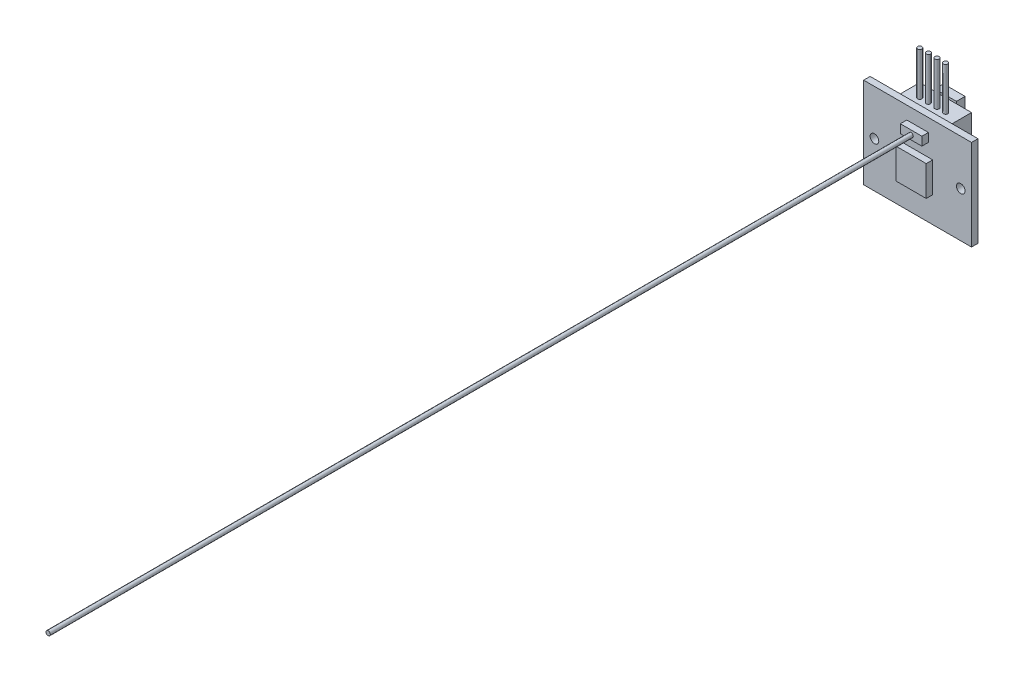
ISO-10303-21;
HEADER;
FILE_DESCRIPTION(('STEP AP214'),'2;1');
FILE_NAME('part.step','',(''),(''),'','','');
FILE_SCHEMA(('AUTOMOTIVE_DESIGN { 1 0 10303 214 1 1 1 1 }'));
ENDSEC;
DATA;
#1=APPLICATION_CONTEXT('core data for automotive mechanical design processes');
#2=APPLICATION_PROTOCOL_DEFINITION('international standard','automotive_design',2000,#1);
#3=PRODUCT_CONTEXT('',#1,'mechanical');
#4=PRODUCT('Part','Part','',(#3));
#5=PRODUCT_RELATED_PRODUCT_CATEGORY('part','',(#4));
#6=PRODUCT_DEFINITION_FORMATION('','',#4);
#7=PRODUCT_DEFINITION_CONTEXT('part definition',#1,'design');
#8=PRODUCT_DEFINITION('design','',#6,#7);
#9=PRODUCT_DEFINITION_SHAPE('','',#8);
#10=(LENGTH_UNIT() NAMED_UNIT(*) SI_UNIT(.MILLI.,.METRE.));
#11=(NAMED_UNIT(*) PLANE_ANGLE_UNIT() SI_UNIT($,.RADIAN.));
#12=(NAMED_UNIT(*) SI_UNIT($,.STERADIAN.) SOLID_ANGLE_UNIT());
#13=UNCERTAINTY_MEASURE_WITH_UNIT(LENGTH_MEASURE(1.E-05),#10,'distance_accuracy_value','');
#14=(GEOMETRIC_REPRESENTATION_CONTEXT(3) GLOBAL_UNCERTAINTY_ASSIGNED_CONTEXT((#13)) GLOBAL_UNIT_ASSIGNED_CONTEXT((#10,
#11,#12)) REPRESENTATION_CONTEXT('',''));
#15=CARTESIAN_POINT('',(0.,0.,0.));
#16=DIRECTION('',(0.,0.,1.));
#17=DIRECTION('',(1.,0.,0.));
#18=AXIS2_PLACEMENT_3D('',#15,#16,#17);
#19=CARTESIAN_POINT('',(0.,6.5,203.));
#20=DIRECTION('',(0.,0.,-1.));
#21=DIRECTION('',(-1.,0.,0.));
#22=AXIS2_PLACEMENT_3D('',#19,#20,#21);
#23=CYLINDRICAL_SURFACE('',#22,0.5);
#24=CARTESIAN_POINT('',(0.,6.5,203.));
#25=DIRECTION('',(0.,0.,1.));
#26=DIRECTION('',(1.,0.,0.));
#27=AXIS2_PLACEMENT_3D('',#24,#25,#26);
#28=CIRCLE('',#27,0.5);
#29=CARTESIAN_POINT('',(0.5,6.5,203.));
#30=VERTEX_POINT('',#29);
#31=EDGE_CURVE('E11',#30,#30,#28,.T.);
#32=ORIENTED_EDGE('',*,*,#31,.F.);
#33=EDGE_LOOP('',(#32));
#34=FACE_BOUND('',#33,.T.);
#35=CARTESIAN_POINT('',(0.,6.5,3.));
#36=DIRECTION('',(0.,0.,1.));
#37=DIRECTION('',(1.,0.,0.));
#38=AXIS2_PLACEMENT_3D('',#35,#36,#37);
#39=CIRCLE('',#38,0.5);
#40=CARTESIAN_POINT('',(0.5,6.5,3.));
#41=VERTEX_POINT('',#40);
#42=EDGE_CURVE('E46',#41,#41,#39,.T.);
#43=ORIENTED_EDGE('',*,*,#42,.T.);
#44=EDGE_LOOP('',(#43));
#45=FACE_BOUND('',#44,.T.);
#46=ADVANCED_FACE('F43',(#34,#45),#23,.T.);
#47=CARTESIAN_POINT('',(0.,6.5,203.));
#48=DIRECTION('',(0.,0.,1.));
#49=DIRECTION('',(1.,0.,0.));
#50=AXIS2_PLACEMENT_3D('',#47,#48,#49);
#51=PLANE('',#50);
#52=ORIENTED_EDGE('',*,*,#31,.T.);
#53=EDGE_LOOP('',(#52));
#54=FACE_BOUND('',#53,.T.);
#55=ADVANCED_FACE('F58',(#54),#51,.T.);
#56=CARTESIAN_POINT('',(0.,6.5,3.));
#57=DIRECTION('',(0.,0.,1.));
#58=DIRECTION('',(1.,0.,0.));
#59=AXIS2_PLACEMENT_3D('',#56,#57,#58);
#60=PLANE('',#59);
#61=ORIENTED_EDGE('',*,*,#42,.F.);
#62=EDGE_LOOP('',(#61));
#63=FACE_BOUND('',#62,.T.);
#64=ADVANCED_FACE('F56',(#63),#60,.F.);
#65=CLOSED_SHELL('',(#46,#55,#64));
#66=MANIFOLD_SOLID_BREP('B2_NOT_SHOWN',#65);
#67=CARTESIAN_POINT('',(3.,20.,-2.));
#68=DIRECTION('',(0.,-1.,0.));
#69=DIRECTION('',(1.,0.,0.));
#70=AXIS2_PLACEMENT_3D('',#67,#68,#69);
#71=CYLINDRICAL_SURFACE('',#70,0.5);
#72=CARTESIAN_POINT('',(3.,20.,-2.));
#73=DIRECTION('',(0.,1.,0.));
#74=DIRECTION('',(-1.,0.,0.));
#75=AXIS2_PLACEMENT_3D('',#72,#73,#74);
#76=CIRCLE('',#75,0.5);
#77=CARTESIAN_POINT('',(2.5,20.,-2.));
#78=VERTEX_POINT('',#77);
#79=EDGE_CURVE('E42',#78,#78,#76,.T.);
#80=ORIENTED_EDGE('',*,*,#79,.F.);
#81=EDGE_LOOP('',(#80));
#82=FACE_BOUND('',#81,.T.);
#83=CARTESIAN_POINT('',(3.,10.,-2.));
#84=DIRECTION('',(0.,1.,0.));
#85=DIRECTION('',(-1.,0.,0.));
#86=AXIS2_PLACEMENT_3D('',#83,#84,#85);
#87=CIRCLE('',#86,0.5);
#88=CARTESIAN_POINT('',(2.5,10.,-2.));
#89=VERTEX_POINT('',#88);
#90=EDGE_CURVE('E94',#89,#89,#87,.T.);
#91=ORIENTED_EDGE('',*,*,#90,.T.);
#92=EDGE_LOOP('',(#91));
#93=FACE_BOUND('',#92,.T.);
#94=ADVANCED_FACE('F91',(#82,#93),#71,.T.);
#95=CARTESIAN_POINT('',(3.,20.,-2.));
#96=DIRECTION('',(0.,1.,0.));
#97=DIRECTION('',(-1.,0.,0.));
#98=AXIS2_PLACEMENT_3D('',#95,#96,#97);
#99=PLANE('',#98);
#100=ORIENTED_EDGE('',*,*,#79,.T.);
#101=EDGE_LOOP('',(#100));
#102=FACE_BOUND('',#101,.T.);
#103=ADVANCED_FACE('F106',(#102),#99,.T.);
#104=CARTESIAN_POINT('',(3.,10.,-2.));
#105=DIRECTION('',(0.,1.,0.));
#106=DIRECTION('',(-1.,0.,0.));
#107=AXIS2_PLACEMENT_3D('',#104,#105,#106);
#108=PLANE('',#107);
#109=ORIENTED_EDGE('',*,*,#90,.F.);
#110=EDGE_LOOP('',(#109));
#111=FACE_BOUND('',#110,.T.);
#112=ADVANCED_FACE('F104',(#111),#108,.F.);
#113=CLOSED_SHELL('',(#94,#103,#112));
#114=MANIFOLD_SOLID_BREP('B6',#113);
#115=CARTESIAN_POINT('',(1.,20.,-2.));
#116=DIRECTION('',(0.,-1.,0.));
#117=DIRECTION('',(1.,0.,0.));
#118=AXIS2_PLACEMENT_3D('',#115,#116,#117);
#119=CYLINDRICAL_SURFACE('',#118,0.5);
#120=CARTESIAN_POINT('',(1.,20.,-2.));
#121=DIRECTION('',(0.,1.,0.));
#122=DIRECTION('',(-1.,0.,0.));
#123=AXIS2_PLACEMENT_3D('',#120,#121,#122);
#124=CIRCLE('',#123,0.5);
#125=CARTESIAN_POINT('',(0.500000000000003,20.,-2.));
#126=VERTEX_POINT('',#125);
#127=EDGE_CURVE('E90',#126,#126,#124,.T.);
#128=ORIENTED_EDGE('',*,*,#127,.F.);
#129=EDGE_LOOP('',(#128));
#130=FACE_BOUND('',#129,.T.);
#131=CARTESIAN_POINT('',(1.,10.,-2.));
#132=DIRECTION('',(0.,1.,0.));
#133=DIRECTION('',(-1.,0.,0.));
#134=AXIS2_PLACEMENT_3D('',#131,#132,#133);
#135=CIRCLE('',#134,0.5);
#136=CARTESIAN_POINT('',(0.500000000000001,10.,-2.));
#137=VERTEX_POINT('',#136);
#138=EDGE_CURVE('E142',#137,#137,#135,.T.);
#139=ORIENTED_EDGE('',*,*,#138,.T.);
#140=EDGE_LOOP('',(#139));
#141=FACE_BOUND('',#140,.T.);
#142=ADVANCED_FACE('F139',(#130,#141),#119,.T.);
#143=CARTESIAN_POINT('',(1.,20.,-2.));
#144=DIRECTION('',(0.,1.,0.));
#145=DIRECTION('',(-1.,0.,0.));
#146=AXIS2_PLACEMENT_3D('',#143,#144,#145);
#147=PLANE('',#146);
#148=ORIENTED_EDGE('',*,*,#127,.T.);
#149=EDGE_LOOP('',(#148));
#150=FACE_BOUND('',#149,.T.);
#151=ADVANCED_FACE('F154',(#150),#147,.T.);
#152=CARTESIAN_POINT('',(1.,10.,-2.));
#153=DIRECTION('',(0.,1.,0.));
#154=DIRECTION('',(-1.,0.,0.));
#155=AXIS2_PLACEMENT_3D('',#152,#153,#154);
#156=PLANE('',#155);
#157=ORIENTED_EDGE('',*,*,#138,.F.);
#158=EDGE_LOOP('',(#157));
#159=FACE_BOUND('',#158,.T.);
#160=ADVANCED_FACE('F152',(#159),#156,.F.);
#161=CLOSED_SHELL('',(#142,#151,#160));
#162=MANIFOLD_SOLID_BREP('B37',#161);
#163=CARTESIAN_POINT('',(-0.999999999999997,20.,-2.));
#164=DIRECTION('',(0.,-1.,0.));
#165=DIRECTION('',(1.,0.,0.));
#166=AXIS2_PLACEMENT_3D('',#163,#164,#165);
#167=CYLINDRICAL_SURFACE('',#166,0.5);
#168=CARTESIAN_POINT('',(-0.999999999999997,20.,-2.));
#169=DIRECTION('',(0.,1.,0.));
#170=DIRECTION('',(-1.,0.,0.));
#171=AXIS2_PLACEMENT_3D('',#168,#169,#170);
#172=CIRCLE('',#171,0.5);
#173=CARTESIAN_POINT('',(-1.5,20.,-2.));
#174=VERTEX_POINT('',#173);
#175=EDGE_CURVE('E138',#174,#174,#172,.T.);
#176=ORIENTED_EDGE('',*,*,#175,.F.);
#177=EDGE_LOOP('',(#176));
#178=FACE_BOUND('',#177,.T.);
#179=CARTESIAN_POINT('',(-0.999999999999999,10.,-2.));
#180=DIRECTION('',(0.,1.,0.));
#181=DIRECTION('',(-1.,0.,0.));
#182=AXIS2_PLACEMENT_3D('',#179,#180,#181);
#183=CIRCLE('',#182,0.5);
#184=CARTESIAN_POINT('',(-1.5,10.,-2.));
#185=VERTEX_POINT('',#184);
#186=EDGE_CURVE('E190',#185,#185,#183,.T.);
#187=ORIENTED_EDGE('',*,*,#186,.T.);
#188=EDGE_LOOP('',(#187));
#189=FACE_BOUND('',#188,.T.);
#190=ADVANCED_FACE('F187',(#178,#189),#167,.T.);
#191=CARTESIAN_POINT('',(-0.999999999999997,20.,-2.));
#192=DIRECTION('',(0.,1.,0.));
#193=DIRECTION('',(-1.,0.,0.));
#194=AXIS2_PLACEMENT_3D('',#191,#192,#193);
#195=PLANE('',#194);
#196=ORIENTED_EDGE('',*,*,#175,.T.);
#197=EDGE_LOOP('',(#196));
#198=FACE_BOUND('',#197,.T.);
#199=ADVANCED_FACE('F202',(#198),#195,.T.);
#200=CARTESIAN_POINT('',(-0.999999999999999,10.,-2.));
#201=DIRECTION('',(0.,1.,0.));
#202=DIRECTION('',(-1.,0.,0.));
#203=AXIS2_PLACEMENT_3D('',#200,#201,#202);
#204=PLANE('',#203);
#205=ORIENTED_EDGE('',*,*,#186,.F.);
#206=EDGE_LOOP('',(#205));
#207=FACE_BOUND('',#206,.T.);
#208=ADVANCED_FACE('F200',(#207),#204,.F.);
#209=CLOSED_SHELL('',(#190,#199,#208));
#210=MANIFOLD_SOLID_BREP('B85',#209);
#211=CARTESIAN_POINT('',(-3.,20.,-2.));
#212=DIRECTION('',(0.,-1.,0.));
#213=DIRECTION('',(1.,0.,0.));
#214=AXIS2_PLACEMENT_3D('',#211,#212,#213);
#215=CYLINDRICAL_SURFACE('',#214,0.5);
#216=CARTESIAN_POINT('',(-3.,20.,-2.));
#217=DIRECTION('',(0.,1.,0.));
#218=DIRECTION('',(-1.,0.,0.));
#219=AXIS2_PLACEMENT_3D('',#216,#217,#218);
#220=CIRCLE('',#219,0.5);
#221=CARTESIAN_POINT('',(-3.5,20.,-2.));
#222=VERTEX_POINT('',#221);
#223=EDGE_CURVE('E186',#222,#222,#220,.T.);
#224=ORIENTED_EDGE('',*,*,#223,.F.);
#225=EDGE_LOOP('',(#224));
#226=FACE_BOUND('',#225,.T.);
#227=CARTESIAN_POINT('',(-3.,10.,-2.));
#228=DIRECTION('',(0.,1.,0.));
#229=DIRECTION('',(-1.,0.,0.));
#230=AXIS2_PLACEMENT_3D('',#227,#228,#229);
#231=CIRCLE('',#230,0.5);
#232=CARTESIAN_POINT('',(-3.5,10.,-2.));
#233=VERTEX_POINT('',#232);
#234=EDGE_CURVE('E240',#233,#233,#231,.T.);
#235=ORIENTED_EDGE('',*,*,#234,.T.);
#236=EDGE_LOOP('',(#235));
#237=FACE_BOUND('',#236,.T.);
#238=ADVANCED_FACE('F237',(#226,#237),#215,.T.);
#239=CARTESIAN_POINT('',(-3.,20.,-2.));
#240=DIRECTION('',(0.,1.,0.));
#241=DIRECTION('',(-1.,0.,0.));
#242=AXIS2_PLACEMENT_3D('',#239,#240,#241);
#243=PLANE('',#242);
#244=ORIENTED_EDGE('',*,*,#223,.T.);
#245=EDGE_LOOP('',(#244));
#246=FACE_BOUND('',#245,.T.);
#247=ADVANCED_FACE('F252',(#246),#243,.T.);
#248=CARTESIAN_POINT('',(-3.,10.,-2.));
#249=DIRECTION('',(0.,1.,0.));
#250=DIRECTION('',(-1.,0.,0.));
#251=AXIS2_PLACEMENT_3D('',#248,#249,#250);
#252=PLANE('',#251);
#253=ORIENTED_EDGE('',*,*,#234,.F.);
#254=EDGE_LOOP('',(#253));
#255=FACE_BOUND('',#254,.T.);
#256=ADVANCED_FACE('F250',(#255),#252,.F.);
#257=CLOSED_SHELL('',(#238,#247,#256));
#258=MANIFOLD_SOLID_BREP('B133',#257);
#259=CARTESIAN_POINT('',(-3.5,2.5,3.));
#260=DIRECTION('',(1.,0.,0.));
#261=DIRECTION('',(0.,1.,0.));
#262=AXIS2_PLACEMENT_3D('',#259,#260,#261);
#263=PLANE('',#262);
#264=DIRECTION('',(0.,-1.,0.));
#265=VECTOR('',#264,1.);
#266=CARTESIAN_POINT('',(-3.5,2.5,1.5));
#267=LINE('',#266,#265);
#268=CARTESIAN_POINT('',(-3.5,2.5,1.5));
#269=VERTEX_POINT('',#268);
#270=CARTESIAN_POINT('',(-3.5,-4.5,1.5));
#271=VERTEX_POINT('',#270);
#272=EDGE_CURVE('E350',#269,#271,#267,.T.);
#273=ORIENTED_EDGE('',*,*,#272,.T.);
#274=DIRECTION('',(0.,0.,-1.));
#275=VECTOR('',#274,1.);
#276=CARTESIAN_POINT('',(-3.5,-4.5,3.));
#277=LINE('',#276,#275);
#278=CARTESIAN_POINT('',(-3.5,-4.5,3.));
#279=VERTEX_POINT('',#278);
#280=EDGE_CURVE('E235',#279,#271,#277,.T.);
#281=ORIENTED_EDGE('',*,*,#280,.F.);
#282=DIRECTION('',(0.,-1.,0.));
#283=VECTOR('',#282,1.);
#284=CARTESIAN_POINT('',(-3.5,2.5,3.));
#285=LINE('',#284,#283);
#286=CARTESIAN_POINT('',(-3.5,2.5,3.));
#287=VERTEX_POINT('',#286);
#288=EDGE_CURVE('E338',#287,#279,#285,.T.);
#289=ORIENTED_EDGE('',*,*,#288,.F.);
#290=DIRECTION('',(0.,0.,-1.));
#291=VECTOR('',#290,1.);
#292=CARTESIAN_POINT('',(-3.5,2.5,3.));
#293=LINE('',#292,#291);
#294=EDGE_CURVE('E346',#287,#269,#293,.T.);
#295=ORIENTED_EDGE('',*,*,#294,.T.);
#296=EDGE_LOOP('',(#273,#281,#289,#295));
#297=FACE_BOUND('',#296,.T.);
#298=ADVANCED_FACE('F287',(#297),#263,.F.);
#299=CARTESIAN_POINT('',(-3.5,-4.5,3.));
#300=DIRECTION('',(0.,1.,0.));
#301=DIRECTION('',(0.,0.,1.));
#302=AXIS2_PLACEMENT_3D('',#299,#300,#301);
#303=PLANE('',#302);
#304=DIRECTION('',(1.,0.,0.));
#305=VECTOR('',#304,1.);
#306=CARTESIAN_POINT('',(-3.5,-4.5,1.5));
#307=LINE('',#306,#305);
#308=CARTESIAN_POINT('',(3.5,-4.5,1.5));
#309=VERTEX_POINT('',#308);
#310=EDGE_CURVE('E342',#271,#309,#307,.T.);
#311=ORIENTED_EDGE('',*,*,#310,.T.);
#312=DIRECTION('',(0.,0.,-1.));
#313=VECTOR('',#312,1.);
#314=CARTESIAN_POINT('',(3.5,-4.5,3.));
#315=LINE('',#314,#313);
#316=CARTESIAN_POINT('',(3.5,-4.5,3.));
#317=VERTEX_POINT('',#316);
#318=EDGE_CURVE('E295',#317,#309,#315,.T.);
#319=ORIENTED_EDGE('',*,*,#318,.F.);
#320=DIRECTION('',(1.,0.,0.));
#321=VECTOR('',#320,1.);
#322=CARTESIAN_POINT('',(-3.5,-4.5,3.));
#323=LINE('',#322,#321);
#324=EDGE_CURVE('E333',#279,#317,#323,.T.);
#325=ORIENTED_EDGE('',*,*,#324,.F.);
#326=ORIENTED_EDGE('',*,*,#280,.T.);
#327=EDGE_LOOP('',(#311,#319,#325,#326));
#328=FACE_BOUND('',#327,.T.);
#329=ADVANCED_FACE('F341',(#328),#303,.F.);
#330=CARTESIAN_POINT('',(3.5,2.5,3.));
#331=DIRECTION('',(-1.,0.,0.));
#332=DIRECTION('',(0.,-1.,0.));
#333=AXIS2_PLACEMENT_3D('',#330,#331,#332);
#334=PLANE('',#333);
#335=DIRECTION('',(0.,1.,0.));
#336=VECTOR('',#335,1.);
#337=CARTESIAN_POINT('',(3.5,2.5,1.5));
#338=LINE('',#337,#336);
#339=CARTESIAN_POINT('',(3.5,2.5,1.5));
#340=VERTEX_POINT('',#339);
#341=EDGE_CURVE('E320',#309,#340,#338,.T.);
#342=ORIENTED_EDGE('',*,*,#341,.T.);
#343=DIRECTION('',(0.,0.,-1.));
#344=VECTOR('',#343,1.);
#345=CARTESIAN_POINT('',(3.5,2.5,3.));
#346=LINE('',#345,#344);
#347=CARTESIAN_POINT('',(3.5,2.5,3.));
#348=VERTEX_POINT('',#347);
#349=EDGE_CURVE('E343',#348,#340,#346,.T.);
#350=ORIENTED_EDGE('',*,*,#349,.F.);
#351=DIRECTION('',(0.,1.,0.));
#352=VECTOR('',#351,1.);
#353=CARTESIAN_POINT('',(3.5,2.5,3.));
#354=LINE('',#353,#352);
#355=EDGE_CURVE('E336',#317,#348,#354,.T.);
#356=ORIENTED_EDGE('',*,*,#355,.F.);
#357=ORIENTED_EDGE('',*,*,#318,.T.);
#358=EDGE_LOOP('',(#342,#350,#356,#357));
#359=FACE_BOUND('',#358,.T.);
#360=ADVANCED_FACE('F344',(#359),#334,.F.);
#361=CARTESIAN_POINT('',(-3.5,2.5,3.));
#362=DIRECTION('',(0.,-1.,0.));
#363=DIRECTION('',(0.,0.,-1.));
#364=AXIS2_PLACEMENT_3D('',#361,#362,#363);
#365=PLANE('',#364);
#366=DIRECTION('',(-1.,0.,0.));
#367=VECTOR('',#366,1.);
#368=CARTESIAN_POINT('',(-3.5,2.5,1.5));
#369=LINE('',#368,#367);
#370=EDGE_CURVE('E326',#340,#269,#369,.T.);
#371=ORIENTED_EDGE('',*,*,#370,.T.);
#372=ORIENTED_EDGE('',*,*,#294,.F.);
#373=DIRECTION('',(-1.,0.,0.));
#374=VECTOR('',#373,1.);
#375=CARTESIAN_POINT('',(-3.5,2.5,3.));
#376=LINE('',#375,#374);
#377=EDGE_CURVE('E303',#348,#287,#376,.T.);
#378=ORIENTED_EDGE('',*,*,#377,.F.);
#379=ORIENTED_EDGE('',*,*,#349,.T.);
#380=EDGE_LOOP('',(#371,#372,#378,#379));
#381=FACE_BOUND('',#380,.T.);
#382=ADVANCED_FACE('F357',(#381),#365,.F.);
#383=CARTESIAN_POINT('',(0.,0.,3.));
#384=DIRECTION('',(0.,0.,1.));
#385=DIRECTION('',(1.,0.,0.));
#386=AXIS2_PLACEMENT_3D('',#383,#384,#385);
#387=PLANE('',#386);
#388=ORIENTED_EDGE('',*,*,#288,.T.);
#389=ORIENTED_EDGE('',*,*,#324,.T.);
#390=ORIENTED_EDGE('',*,*,#355,.T.);
#391=ORIENTED_EDGE('',*,*,#377,.T.);
#392=EDGE_LOOP('',(#388,#389,#390,#391));
#393=FACE_BOUND('',#392,.T.);
#394=ADVANCED_FACE('F334',(#393),#387,.T.);
#395=CARTESIAN_POINT('',(0.,0.,1.5));
#396=DIRECTION('',(0.,0.,1.));
#397=DIRECTION('',(1.,0.,0.));
#398=AXIS2_PLACEMENT_3D('',#395,#396,#397);
#399=PLANE('',#398);
#400=ORIENTED_EDGE('',*,*,#272,.F.);
#401=ORIENTED_EDGE('',*,*,#370,.F.);
#402=ORIENTED_EDGE('',*,*,#341,.F.);
#403=ORIENTED_EDGE('',*,*,#310,.F.);
#404=EDGE_LOOP('',(#400,#401,#402,#403));
#405=FACE_BOUND('',#404,.T.);
#406=ADVANCED_FACE('F360',(#405),#399,.F.);
#407=CLOSED_SHELL('',(#298,#329,#360,#382,#394,#406));
#408=MANIFOLD_SOLID_BREP('B181',#407);
#409=CARTESIAN_POINT('',(-2.5,7.5,3.));
#410=DIRECTION('',(1.,0.,0.));
#411=DIRECTION('',(0.,1.,0.));
#412=AXIS2_PLACEMENT_3D('',#409,#410,#411);
#413=PLANE('',#412);
#414=DIRECTION('',(0.,-1.,0.));
#415=VECTOR('',#414,1.);
#416=CARTESIAN_POINT('',(-2.5,7.5,1.5));
#417=LINE('',#416,#415);
#418=CARTESIAN_POINT('',(-2.5,7.5,1.5));
#419=VERTEX_POINT('',#418);
#420=CARTESIAN_POINT('',(-2.5,5.5,1.5));
#421=VERTEX_POINT('',#420);
#422=EDGE_CURVE('E483',#419,#421,#417,.T.);
#423=ORIENTED_EDGE('',*,*,#422,.T.);
#424=DIRECTION('',(0.,0.,-1.));
#425=VECTOR('',#424,1.);
#426=CARTESIAN_POINT('',(-2.5,5.5,3.));
#427=LINE('',#426,#425);
#428=CARTESIAN_POINT('',(-2.5,5.5,3.));
#429=VERTEX_POINT('',#428);
#430=EDGE_CURVE('E285',#429,#421,#427,.T.);
#431=ORIENTED_EDGE('',*,*,#430,.F.);
#432=DIRECTION('',(0.,-1.,0.));
#433=VECTOR('',#432,1.);
#434=CARTESIAN_POINT('',(-2.5,7.5,3.));
#435=LINE('',#434,#433);
#436=CARTESIAN_POINT('',(-2.5,7.5,3.));
#437=VERTEX_POINT('',#436);
#438=EDGE_CURVE('E471',#437,#429,#435,.T.);
#439=ORIENTED_EDGE('',*,*,#438,.F.);
#440=DIRECTION('',(0.,0.,-1.));
#441=VECTOR('',#440,1.);
#442=CARTESIAN_POINT('',(-2.5,7.5,3.));
#443=LINE('',#442,#441);
#444=EDGE_CURVE('E479',#437,#419,#443,.T.);
#445=ORIENTED_EDGE('',*,*,#444,.T.);
#446=EDGE_LOOP('',(#423,#431,#439,#445));
#447=FACE_BOUND('',#446,.T.);
#448=ADVANCED_FACE('F420',(#447),#413,.F.);
#449=CARTESIAN_POINT('',(-2.5,5.5,3.));
#450=DIRECTION('',(0.,1.,0.));
#451=DIRECTION('',(0.,0.,1.));
#452=AXIS2_PLACEMENT_3D('',#449,#450,#451);
#453=PLANE('',#452);
#454=DIRECTION('',(1.,0.,0.));
#455=VECTOR('',#454,1.);
#456=CARTESIAN_POINT('',(-2.5,5.5,1.5));
#457=LINE('',#456,#455);
#458=CARTESIAN_POINT('',(2.5,5.5,1.5));
#459=VERTEX_POINT('',#458);
#460=EDGE_CURVE('E475',#421,#459,#457,.T.);
#461=ORIENTED_EDGE('',*,*,#460,.T.);
#462=DIRECTION('',(0.,0.,-1.));
#463=VECTOR('',#462,1.);
#464=CARTESIAN_POINT('',(2.5,5.5,3.));
#465=LINE('',#464,#463);
#466=CARTESIAN_POINT('',(2.5,5.5,3.));
#467=VERTEX_POINT('',#466);
#468=EDGE_CURVE('E428',#467,#459,#465,.T.);
#469=ORIENTED_EDGE('',*,*,#468,.F.);
#470=DIRECTION('',(1.,0.,0.));
#471=VECTOR('',#470,1.);
#472=CARTESIAN_POINT('',(-2.5,5.5,3.));
#473=LINE('',#472,#471);
#474=EDGE_CURVE('E466',#429,#467,#473,.T.);
#475=ORIENTED_EDGE('',*,*,#474,.F.);
#476=ORIENTED_EDGE('',*,*,#430,.T.);
#477=EDGE_LOOP('',(#461,#469,#475,#476));
#478=FACE_BOUND('',#477,.T.);
#479=ADVANCED_FACE('F474',(#478),#453,.F.);
#480=CARTESIAN_POINT('',(2.5,7.5,3.));
#481=DIRECTION('',(-1.,0.,0.));
#482=DIRECTION('',(0.,-1.,0.));
#483=AXIS2_PLACEMENT_3D('',#480,#481,#482);
#484=PLANE('',#483);
#485=DIRECTION('',(0.,1.,0.));
#486=VECTOR('',#485,1.);
#487=CARTESIAN_POINT('',(2.5,7.5,1.5));
#488=LINE('',#487,#486);
#489=CARTESIAN_POINT('',(2.5,7.5,1.5));
#490=VERTEX_POINT('',#489);
#491=EDGE_CURVE('E453',#459,#490,#488,.T.);
#492=ORIENTED_EDGE('',*,*,#491,.T.);
#493=DIRECTION('',(0.,0.,-1.));
#494=VECTOR('',#493,1.);
#495=CARTESIAN_POINT('',(2.5,7.5,3.));
#496=LINE('',#495,#494);
#497=CARTESIAN_POINT('',(2.5,7.5,3.));
#498=VERTEX_POINT('',#497);
#499=EDGE_CURVE('E476',#498,#490,#496,.T.);
#500=ORIENTED_EDGE('',*,*,#499,.F.);
#501=DIRECTION('',(0.,1.,0.));
#502=VECTOR('',#501,1.);
#503=CARTESIAN_POINT('',(2.5,7.5,3.));
#504=LINE('',#503,#502);
#505=EDGE_CURVE('E469',#467,#498,#504,.T.);
#506=ORIENTED_EDGE('',*,*,#505,.F.);
#507=ORIENTED_EDGE('',*,*,#468,.T.);
#508=EDGE_LOOP('',(#492,#500,#506,#507));
#509=FACE_BOUND('',#508,.T.);
#510=ADVANCED_FACE('F477',(#509),#484,.F.);
#511=CARTESIAN_POINT('',(-2.5,7.5,3.));
#512=DIRECTION('',(0.,-1.,0.));
#513=DIRECTION('',(0.,0.,-1.));
#514=AXIS2_PLACEMENT_3D('',#511,#512,#513);
#515=PLANE('',#514);
#516=DIRECTION('',(-1.,0.,0.));
#517=VECTOR('',#516,1.);
#518=CARTESIAN_POINT('',(-2.5,7.5,1.5));
#519=LINE('',#518,#517);
#520=EDGE_CURVE('E459',#490,#419,#519,.T.);
#521=ORIENTED_EDGE('',*,*,#520,.T.);
#522=ORIENTED_EDGE('',*,*,#444,.F.);
#523=DIRECTION('',(-1.,0.,0.));
#524=VECTOR('',#523,1.);
#525=CARTESIAN_POINT('',(-2.5,7.5,3.));
#526=LINE('',#525,#524);
#527=EDGE_CURVE('E436',#498,#437,#526,.T.);
#528=ORIENTED_EDGE('',*,*,#527,.F.);
#529=ORIENTED_EDGE('',*,*,#499,.T.);
#530=EDGE_LOOP('',(#521,#522,#528,#529));
#531=FACE_BOUND('',#530,.T.);
#532=ADVANCED_FACE('F490',(#531),#515,.F.);
#533=CARTESIAN_POINT('',(0.,0.,3.));
#534=DIRECTION('',(0.,0.,1.));
#535=DIRECTION('',(1.,0.,0.));
#536=AXIS2_PLACEMENT_3D('',#533,#534,#535);
#537=PLANE('',#536);
#538=ORIENTED_EDGE('',*,*,#438,.T.);
#539=ORIENTED_EDGE('',*,*,#474,.T.);
#540=ORIENTED_EDGE('',*,*,#505,.T.);
#541=ORIENTED_EDGE('',*,*,#527,.T.);
#542=EDGE_LOOP('',(#538,#539,#540,#541));
#543=FACE_BOUND('',#542,.T.);
#544=ADVANCED_FACE('F467',(#543),#537,.T.);
#545=CARTESIAN_POINT('',(0.,0.,1.5));
#546=DIRECTION('',(0.,0.,1.));
#547=DIRECTION('',(1.,0.,0.));
#548=AXIS2_PLACEMENT_3D('',#545,#546,#547);
#549=PLANE('',#548);
#550=ORIENTED_EDGE('',*,*,#422,.F.);
#551=ORIENTED_EDGE('',*,*,#520,.F.);
#552=ORIENTED_EDGE('',*,*,#491,.F.);
#553=ORIENTED_EDGE('',*,*,#460,.F.);
#554=EDGE_LOOP('',(#550,#551,#552,#553));
#555=FACE_BOUND('',#554,.T.);
#556=ADVANCED_FACE('F493',(#555),#549,.F.);
#557=CLOSED_SHELL('',(#448,#479,#510,#532,#544,#556));
#558=MANIFOLD_SOLID_BREP('B229',#557);
#559=CARTESIAN_POINT('',(6.,10.,-5.));
#560=DIRECTION('',(-1.,0.,0.));
#561=DIRECTION('',(0.,0.,1.));
#562=AXIS2_PLACEMENT_3D('',#559,#560,#561);
#563=PLANE('',#562);
#564=DIRECTION('',(0.,-1.,0.));
#565=VECTOR('',#564,1.);
#566=CARTESIAN_POINT('',(6.,10.,0.));
#567=LINE('',#566,#565);
#568=CARTESIAN_POINT('',(6.,10.,0.));
#569=VERTEX_POINT('',#568);
#570=CARTESIAN_POINT('',(6.,0.,0.));
#571=VERTEX_POINT('',#570);
#572=EDGE_CURVE('E643',#569,#571,#567,.T.);
#573=ORIENTED_EDGE('',*,*,#572,.T.);
#574=DIRECTION('',(0.,0.,1.));
#575=VECTOR('',#574,1.);
#576=CARTESIAN_POINT('',(6.,0.,-5.));
#577=LINE('',#576,#575);
#578=CARTESIAN_POINT('',(6.,0.,-5.));
#579=VERTEX_POINT('',#578);
#580=EDGE_CURVE('E555',#579,#571,#577,.T.);
#581=ORIENTED_EDGE('',*,*,#580,.F.);
#582=DIRECTION('',(0.,-1.,0.));
#583=VECTOR('',#582,1.);
#584=CARTESIAN_POINT('',(6.,10.,-5.));
#585=LINE('',#584,#583);
#586=CARTESIAN_POINT('',(6.,10.,-5.));
#587=VERTEX_POINT('',#586);
#588=EDGE_CURVE('E652',#587,#579,#585,.T.);
#589=ORIENTED_EDGE('',*,*,#588,.F.);
#590=DIRECTION('',(0.,0.,1.));
#591=VECTOR('',#590,1.);
#592=CARTESIAN_POINT('',(6.,10.,-5.));
#593=LINE('',#592,#591);
#594=EDGE_CURVE('E663',#587,#569,#593,.T.);
#595=ORIENTED_EDGE('',*,*,#594,.T.);
#596=EDGE_LOOP('',(#573,#581,#589,#595));
#597=FACE_BOUND('',#596,.T.);
#598=ADVANCED_FACE('F552',(#597),#563,.F.);
#599=CARTESIAN_POINT('',(6.,0.,-5.));
#600=DIRECTION('',(0.,1.,0.));
#601=DIRECTION('',(0.,0.,1.));
#602=AXIS2_PLACEMENT_3D('',#599,#600,#601);
#603=PLANE('',#602);
#604=DIRECTION('',(-1.,0.,0.));
#605=VECTOR('',#604,1.);
#606=CARTESIAN_POINT('',(6.,0.,0.));
#607=LINE('',#606,#605);
#608=CARTESIAN_POINT('',(-6.,0.,0.));
#609=VERTEX_POINT('',#608);
#610=EDGE_CURVE('E646',#571,#609,#607,.T.);
#611=ORIENTED_EDGE('',*,*,#610,.T.);
#612=DIRECTION('',(0.,0.,1.));
#613=VECTOR('',#612,1.);
#614=CARTESIAN_POINT('',(-6.,0.,-5.));
#615=LINE('',#614,#613);
#616=CARTESIAN_POINT('',(-6.,0.,-5.));
#617=VERTEX_POINT('',#616);
#618=EDGE_CURVE('E674',#617,#609,#615,.T.);
#619=ORIENTED_EDGE('',*,*,#618,.F.);
#620=DIRECTION('',(-1.,0.,0.));
#621=VECTOR('',#620,1.);
#622=CARTESIAN_POINT('',(6.,0.,-5.));
#623=LINE('',#622,#621);
#624=EDGE_CURVE('E655',#579,#617,#623,.T.);
#625=ORIENTED_EDGE('',*,*,#624,.F.);
#626=ORIENTED_EDGE('',*,*,#580,.T.);
#627=EDGE_LOOP('',(#611,#619,#625,#626));
#628=FACE_BOUND('',#627,.T.);
#629=ADVANCED_FACE('F683',(#628),#603,.F.);
#630=CARTESIAN_POINT('',(-6.,10.,-5.));
#631=DIRECTION('',(1.,0.,0.));
#632=DIRECTION('',(0.,1.,0.));
#633=AXIS2_PLACEMENT_3D('',#630,#631,#632);
#634=PLANE('',#633);
#635=DIRECTION('',(0.,1.,0.));
#636=VECTOR('',#635,1.);
#637=CARTESIAN_POINT('',(-6.,10.,0.));
#638=LINE('',#637,#636);
#639=CARTESIAN_POINT('',(-6.,10.,0.));
#640=VERTEX_POINT('',#639);
#641=EDGE_CURVE('E667',#609,#640,#638,.T.);
#642=ORIENTED_EDGE('',*,*,#641,.T.);
#643=DIRECTION('',(0.,0.,1.));
#644=VECTOR('',#643,1.);
#645=CARTESIAN_POINT('',(-6.,10.,-5.));
#646=LINE('',#645,#644);
#647=CARTESIAN_POINT('',(-6.,10.,-5.));
#648=VERTEX_POINT('',#647);
#649=EDGE_CURVE('E672',#648,#640,#646,.T.);
#650=ORIENTED_EDGE('',*,*,#649,.F.);
#651=DIRECTION('',(0.,1.,0.));
#652=VECTOR('',#651,1.);
#653=CARTESIAN_POINT('',(-6.,10.,-5.));
#654=LINE('',#653,#652);
#655=EDGE_CURVE('E658',#617,#648,#654,.T.);
#656=ORIENTED_EDGE('',*,*,#655,.F.);
#657=ORIENTED_EDGE('',*,*,#618,.T.);
#658=EDGE_LOOP('',(#642,#650,#656,#657));
#659=FACE_BOUND('',#658,.T.);
#660=ADVANCED_FACE('F692',(#659),#634,.F.);
#661=CARTESIAN_POINT('',(6.,10.,-5.));
#662=DIRECTION('',(0.,-1.,0.));
#663=DIRECTION('',(1.,0.,0.));
#664=AXIS2_PLACEMENT_3D('',#661,#662,#663);
#665=PLANE('',#664);
#666=DIRECTION('',(1.,0.,0.));
#667=VECTOR('',#666,1.);
#668=CARTESIAN_POINT('',(6.,10.,0.));
#669=LINE('',#668,#667);
#670=EDGE_CURVE('E656',#640,#569,#669,.T.);
#671=ORIENTED_EDGE('',*,*,#670,.T.);
#672=ORIENTED_EDGE('',*,*,#594,.F.);
#673=DIRECTION('',(1.,0.,0.));
#674=VECTOR('',#673,1.);
#675=CARTESIAN_POINT('',(6.,10.,-5.));
#676=LINE('',#675,#674);
#677=CARTESIAN_POINT('',(2.5,10.,-5.));
#678=VERTEX_POINT('',#677);
#679=EDGE_CURVE('E660',#678,#587,#676,.T.);
#680=ORIENTED_EDGE('',*,*,#679,.F.);
#681=CARTESIAN_POINT('',(-2.5,10.,-5.));
#682=VERTEX_POINT('',#681);
#683=EDGE_CURVE('E664',#682,#678,#676,.T.);
#684=ORIENTED_EDGE('',*,*,#683,.F.);
#685=EDGE_CURVE('E661',#648,#682,#676,.T.);
#686=ORIENTED_EDGE('',*,*,#685,.F.);
#687=ORIENTED_EDGE('',*,*,#649,.T.);
#688=EDGE_LOOP('',(#671,#672,#680,#684,#686,#687));
#689=FACE_BOUND('',#688,.T.);
#690=ADVANCED_FACE('F695',(#689),#665,.F.);
#691=CARTESIAN_POINT('',(0.,0.,-5.));
#692=DIRECTION('',(0.,0.,-1.));
#693=DIRECTION('',(-1.,0.,0.));
#694=AXIS2_PLACEMENT_3D('',#691,#692,#693);
#695=PLANE('',#694);
#696=DIRECTION('',(0.,-1.,0.));
#697=VECTOR('',#696,1.);
#698=CARTESIAN_POINT('',(2.5,10.5,-5.));
#699=LINE('',#698,#697);
#700=CARTESIAN_POINT('',(2.5,2.5,-5.));
#701=VERTEX_POINT('',#700);
#702=EDGE_CURVE('E418',#678,#701,#699,.T.);
#703=ORIENTED_EDGE('',*,*,#702,.F.);
#704=ORIENTED_EDGE('',*,*,#679,.T.);
#705=ORIENTED_EDGE('',*,*,#588,.T.);
#706=ORIENTED_EDGE('',*,*,#624,.T.);
#707=ORIENTED_EDGE('',*,*,#655,.T.);
#708=ORIENTED_EDGE('',*,*,#685,.T.);
#709=DIRECTION('',(0.,1.,0.));
#710=VECTOR('',#709,1.);
#711=CARTESIAN_POINT('',(-2.5,10.5,-5.));
#712=LINE('',#711,#710);
#713=CARTESIAN_POINT('',(-2.5,2.5,-5.));
#714=VERTEX_POINT('',#713);
#715=EDGE_CURVE('E700',#714,#682,#712,.T.);
#716=ORIENTED_EDGE('',*,*,#715,.F.);
#717=DIRECTION('',(-1.,0.,0.));
#718=VECTOR('',#717,1.);
#719=CARTESIAN_POINT('',(2.5,2.5,-5.));
#720=LINE('',#719,#718);
#721=EDGE_CURVE('E568',#701,#714,#720,.T.);
#722=ORIENTED_EDGE('',*,*,#721,.F.);
#723=EDGE_LOOP('',(#703,#704,#705,#706,#707,#708,#716,#722));
#724=FACE_BOUND('',#723,.T.);
#725=ADVANCED_FACE('F698',(#724),#695,.T.);
#726=CARTESIAN_POINT('',(0.,0.,0.));
#727=DIRECTION('',(0.,0.,-1.));
#728=DIRECTION('',(-1.,0.,0.));
#729=AXIS2_PLACEMENT_3D('',#726,#727,#728);
#730=PLANE('',#729);
#731=ORIENTED_EDGE('',*,*,#572,.F.);
#732=ORIENTED_EDGE('',*,*,#670,.F.);
#733=ORIENTED_EDGE('',*,*,#641,.F.);
#734=ORIENTED_EDGE('',*,*,#610,.F.);
#735=EDGE_LOOP('',(#731,#732,#733,#734));
#736=FACE_BOUND('',#735,.T.);
#737=ADVANCED_FACE('F690',(#736),#730,.F.);
#738=CARTESIAN_POINT('',(0.,0.,-5.));
#739=DIRECTION('',(0.,0.,-1.));
#740=DIRECTION('',(-1.,0.,0.));
#741=AXIS2_PLACEMENT_3D('',#738,#739,#740);
#742=PLANE('',#741);
#743=CARTESIAN_POINT('',(-2.5,10.5,-5.));
#744=VERTEX_POINT('',#743);
#745=EDGE_CURVE('E703',#682,#744,#712,.T.);
#746=ORIENTED_EDGE('',*,*,#745,.F.);
#747=ORIENTED_EDGE('',*,*,#683,.T.);
#748=CARTESIAN_POINT('',(2.5,10.5,-5.));
#749=VERTEX_POINT('',#748);
#750=EDGE_CURVE('E561',#749,#678,#699,.T.);
#751=ORIENTED_EDGE('',*,*,#750,.F.);
#752=DIRECTION('',(1.,0.,0.));
#753=VECTOR('',#752,1.);
#754=CARTESIAN_POINT('',(2.5,10.5,-5.));
#755=LINE('',#754,#753);
#756=EDGE_CURVE('E639',#744,#749,#755,.T.);
#757=ORIENTED_EDGE('',*,*,#756,.F.);
#758=EDGE_LOOP('',(#746,#747,#751,#757));
#759=FACE_BOUND('',#758,.T.);
#760=ADVANCED_FACE('F704',(#759),#742,.F.);
#761=CARTESIAN_POINT('',(2.5,10.5,-7.));
#762=DIRECTION('',(-1.,0.,0.));
#763=DIRECTION('',(0.,-1.,0.));
#764=AXIS2_PLACEMENT_3D('',#761,#762,#763);
#765=PLANE('',#764);
#766=ORIENTED_EDGE('',*,*,#750,.T.);
#767=ORIENTED_EDGE('',*,*,#702,.T.);
#768=DIRECTION('',(0.,0.,1.));
#769=VECTOR('',#768,1.);
#770=CARTESIAN_POINT('',(2.5,2.5,-7.));
#771=LINE('',#770,#769);
#772=CARTESIAN_POINT('',(2.5,2.5,-7.));
#773=VERTEX_POINT('',#772);
#774=EDGE_CURVE('E624',#773,#701,#771,.T.);
#775=ORIENTED_EDGE('',*,*,#774,.F.);
#776=DIRECTION('',(0.,-1.,0.));
#777=VECTOR('',#776,1.);
#778=CARTESIAN_POINT('',(2.5,10.5,-7.));
#779=LINE('',#778,#777);
#780=CARTESIAN_POINT('',(2.5,10.5,-7.));
#781=VERTEX_POINT('',#780);
#782=EDGE_CURVE('E630',#781,#773,#779,.T.);
#783=ORIENTED_EDGE('',*,*,#782,.F.);
#784=DIRECTION('',(0.,0.,1.));
#785=VECTOR('',#784,1.);
#786=CARTESIAN_POINT('',(2.5,10.5,-7.));
#787=LINE('',#786,#785);
#788=EDGE_CURVE('E714',#781,#749,#787,.T.);
#789=ORIENTED_EDGE('',*,*,#788,.T.);
#790=EDGE_LOOP('',(#766,#767,#775,#783,#789));
#791=FACE_BOUND('',#790,.T.);
#792=ADVANCED_FACE('F642',(#791),#765,.F.);
#793=CARTESIAN_POINT('',(2.5,2.5,-7.));
#794=DIRECTION('',(0.,1.,0.));
#795=DIRECTION('',(0.,0.,1.));
#796=AXIS2_PLACEMENT_3D('',#793,#794,#795);
#797=PLANE('',#796);
#798=ORIENTED_EDGE('',*,*,#721,.T.);
#799=DIRECTION('',(0.,0.,1.));
#800=VECTOR('',#799,1.);
#801=CARTESIAN_POINT('',(-2.5,2.5,-7.));
#802=LINE('',#801,#800);
#803=CARTESIAN_POINT('',(-2.5,2.5,-7.));
#804=VERTEX_POINT('',#803);
#805=EDGE_CURVE('E626',#804,#714,#802,.T.);
#806=ORIENTED_EDGE('',*,*,#805,.F.);
#807=DIRECTION('',(-1.,0.,0.));
#808=VECTOR('',#807,1.);
#809=CARTESIAN_POINT('',(2.5,2.5,-7.));
#810=LINE('',#809,#808);
#811=EDGE_CURVE('E620',#773,#804,#810,.T.);
#812=ORIENTED_EDGE('',*,*,#811,.F.);
#813=ORIENTED_EDGE('',*,*,#774,.T.);
#814=EDGE_LOOP('',(#798,#806,#812,#813));
#815=FACE_BOUND('',#814,.T.);
#816=ADVANCED_FACE('F622',(#815),#797,.F.);
#817=CARTESIAN_POINT('',(-2.5,10.5,-7.));
#818=DIRECTION('',(1.,0.,0.));
#819=DIRECTION('',(0.,1.,0.));
#820=AXIS2_PLACEMENT_3D('',#817,#818,#819);
#821=PLANE('',#820);
#822=ORIENTED_EDGE('',*,*,#715,.T.);
#823=ORIENTED_EDGE('',*,*,#745,.T.);
#824=DIRECTION('',(0.,0.,1.));
#825=VECTOR('',#824,1.);
#826=CARTESIAN_POINT('',(-2.5,10.5,-7.));
#827=LINE('',#826,#825);
#828=CARTESIAN_POINT('',(-2.5,10.5,-7.));
#829=VERTEX_POINT('',#828);
#830=EDGE_CURVE('E648',#829,#744,#827,.T.);
#831=ORIENTED_EDGE('',*,*,#830,.F.);
#832=DIRECTION('',(0.,1.,0.));
#833=VECTOR('',#832,1.);
#834=CARTESIAN_POINT('',(-2.5,10.5,-7.));
#835=LINE('',#834,#833);
#836=EDGE_CURVE('E629',#804,#829,#835,.T.);
#837=ORIENTED_EDGE('',*,*,#836,.F.);
#838=ORIENTED_EDGE('',*,*,#805,.T.);
#839=EDGE_LOOP('',(#822,#823,#831,#837,#838));
#840=FACE_BOUND('',#839,.T.);
#841=ADVANCED_FACE('F710',(#840),#821,.F.);
#842=CARTESIAN_POINT('',(2.5,10.5,-7.));
#843=DIRECTION('',(0.,-1.,0.));
#844=DIRECTION('',(0.,0.,-1.));
#845=AXIS2_PLACEMENT_3D('',#842,#843,#844);
#846=PLANE('',#845);
#847=ORIENTED_EDGE('',*,*,#756,.T.);
#848=ORIENTED_EDGE('',*,*,#788,.F.);
#849=DIRECTION('',(1.,0.,0.));
#850=VECTOR('',#849,1.);
#851=CARTESIAN_POINT('',(2.5,10.5,-7.));
#852=LINE('',#851,#850);
#853=EDGE_CURVE('E635',#829,#781,#852,.T.);
#854=ORIENTED_EDGE('',*,*,#853,.F.);
#855=ORIENTED_EDGE('',*,*,#830,.T.);
#856=EDGE_LOOP('',(#847,#848,#854,#855));
#857=FACE_BOUND('',#856,.T.);
#858=ADVANCED_FACE('F716',(#857),#846,.F.);
#859=CARTESIAN_POINT('',(0.,0.,-7.));
#860=DIRECTION('',(0.,0.,-1.));
#861=DIRECTION('',(-1.,0.,0.));
#862=AXIS2_PLACEMENT_3D('',#859,#860,#861);
#863=PLANE('',#862);
#864=ORIENTED_EDGE('',*,*,#782,.T.);
#865=ORIENTED_EDGE('',*,*,#811,.T.);
#866=ORIENTED_EDGE('',*,*,#836,.T.);
#867=ORIENTED_EDGE('',*,*,#853,.T.);
#868=EDGE_LOOP('',(#864,#865,#866,#867));
#869=FACE_BOUND('',#868,.T.);
#870=ADVANCED_FACE('F633',(#869),#863,.T.);
#871=CLOSED_SHELL('',(#598,#629,#660,#690,#725,#737,#760,#792,#816,#841,#858,#870));
#872=MANIFOLD_SOLID_BREP('B279',#871);
#873=CARTESIAN_POINT('',(0.,0.,1.5));
#874=DIRECTION('',(0.,0.,-1.));
#875=DIRECTION('',(-1.,0.,0.));
#876=AXIS2_PLACEMENT_3D('',#873,#874,#875);
#877=PLANE('',#876);
#878=CARTESIAN_POINT('',(-10.,0.,1.5));
#879=DIRECTION('',(0.,0.,1.));
#880=DIRECTION('',(1.,0.,0.));
#881=AXIS2_PLACEMENT_3D('',#878,#879,#880);
#882=CIRCLE('',#881,1.);
#883=CARTESIAN_POINT('',(-9.,0.,1.5));
#884=VERTEX_POINT('',#883);
#885=EDGE_CURVE('E882',#884,#884,#882,.T.);
#886=ORIENTED_EDGE('',*,*,#885,.F.);
#887=EDGE_LOOP('',(#886));
#888=FACE_BOUND('',#887,.T.);
#889=DIRECTION('',(0.,1.,0.));
#890=VECTOR('',#889,1.);
#891=CARTESIAN_POINT('',(12.5,-10.5,1.5));
#892=LINE('',#891,#890);
#893=CARTESIAN_POINT('',(12.5,-10.5,1.5));
#894=VERTEX_POINT('',#893);
#895=CARTESIAN_POINT('',(12.5,10.5,1.5));
#896=VERTEX_POINT('',#895);
#897=EDGE_CURVE('E867',#894,#896,#892,.T.);
#898=ORIENTED_EDGE('',*,*,#897,.T.);
#899=DIRECTION('',(-1.,0.,0.));
#900=VECTOR('',#899,1.);
#901=CARTESIAN_POINT('',(-12.5,10.5,1.5));
#902=LINE('',#901,#900);
#903=CARTESIAN_POINT('',(-12.5,10.5,1.5));
#904=VERTEX_POINT('',#903);
#905=EDGE_CURVE('E862',#896,#904,#902,.T.);
#906=ORIENTED_EDGE('',*,*,#905,.T.);
#907=DIRECTION('',(0.,-1.,0.));
#908=VECTOR('',#907,1.);
#909=CARTESIAN_POINT('',(-12.5,-10.5,1.5));
#910=LINE('',#909,#908);
#911=CARTESIAN_POINT('',(-12.5,-10.5,1.5));
#912=VERTEX_POINT('',#911);
#913=EDGE_CURVE('E865',#904,#912,#910,.T.);
#914=ORIENTED_EDGE('',*,*,#913,.T.);
#915=DIRECTION('',(1.,0.,0.));
#916=VECTOR('',#915,1.);
#917=CARTESIAN_POINT('',(-12.5,-10.5,1.5));
#918=LINE('',#917,#916);
#919=EDGE_CURVE('E832',#912,#894,#918,.T.);
#920=ORIENTED_EDGE('',*,*,#919,.T.);
#921=EDGE_LOOP('',(#898,#906,#914,#920));
#922=FACE_BOUND('',#921,.T.);
#923=CARTESIAN_POINT('',(10.,0.,1.5));
#924=DIRECTION('',(0.,0.,1.));
#925=DIRECTION('',(-1.,0.,0.));
#926=AXIS2_PLACEMENT_3D('',#923,#924,#925);
#927=CIRCLE('',#926,1.);
#928=CARTESIAN_POINT('',(9.,0.,1.5));
#929=VERTEX_POINT('',#928);
#930=EDGE_CURVE('E897',#929,#929,#927,.T.);
#931=ORIENTED_EDGE('',*,*,#930,.F.);
#932=EDGE_LOOP('',(#931));
#933=FACE_BOUND('',#932,.T.);
#934=ADVANCED_FACE('F815',(#888,#922,#933),#877,.F.);
#935=CARTESIAN_POINT('',(0.,0.,0.));
#936=DIRECTION('',(0.,0.,-1.));
#937=DIRECTION('',(-1.,0.,0.));
#938=AXIS2_PLACEMENT_3D('',#935,#936,#937);
#939=PLANE('',#938);
#940=CARTESIAN_POINT('',(-10.,0.,0.));
#941=DIRECTION('',(0.,0.,1.));
#942=DIRECTION('',(1.,0.,0.));
#943=AXIS2_PLACEMENT_3D('',#940,#941,#942);
#944=CIRCLE('',#943,1.);
#945=CARTESIAN_POINT('',(-9.,0.,0.));
#946=VERTEX_POINT('',#945);
#947=EDGE_CURVE('E894',#946,#946,#944,.T.);
#948=ORIENTED_EDGE('',*,*,#947,.T.);
#949=EDGE_LOOP('',(#948));
#950=FACE_BOUND('',#949,.T.);
#951=DIRECTION('',(0.,1.,0.));
#952=VECTOR('',#951,1.);
#953=CARTESIAN_POINT('',(12.5,-10.5,0.));
#954=LINE('',#953,#952);
#955=CARTESIAN_POINT('',(12.5,-10.5,0.));
#956=VERTEX_POINT('',#955);
#957=CARTESIAN_POINT('',(12.5,10.5,0.));
#958=VERTEX_POINT('',#957);
#959=EDGE_CURVE('E879',#956,#958,#954,.T.);
#960=ORIENTED_EDGE('',*,*,#959,.F.);
#961=DIRECTION('',(1.,0.,0.));
#962=VECTOR('',#961,1.);
#963=CARTESIAN_POINT('',(-12.5,-10.5,0.));
#964=LINE('',#963,#962);
#965=CARTESIAN_POINT('',(-12.5,-10.5,0.));
#966=VERTEX_POINT('',#965);
#967=EDGE_CURVE('E855',#966,#956,#964,.T.);
#968=ORIENTED_EDGE('',*,*,#967,.F.);
#969=DIRECTION('',(0.,-1.,0.));
#970=VECTOR('',#969,1.);
#971=CARTESIAN_POINT('',(-12.5,-10.5,0.));
#972=LINE('',#971,#970);
#973=CARTESIAN_POINT('',(-12.5,10.5,0.));
#974=VERTEX_POINT('',#973);
#975=EDGE_CURVE('E849',#974,#966,#972,.T.);
#976=ORIENTED_EDGE('',*,*,#975,.F.);
#977=DIRECTION('',(-1.,0.,0.));
#978=VECTOR('',#977,1.);
#979=CARTESIAN_POINT('',(-12.5,10.5,0.));
#980=LINE('',#979,#978);
#981=EDGE_CURVE('E871',#958,#974,#980,.T.);
#982=ORIENTED_EDGE('',*,*,#981,.F.);
#983=EDGE_LOOP('',(#960,#968,#976,#982));
#984=FACE_BOUND('',#983,.T.);
#985=CARTESIAN_POINT('',(10.,0.,0.));
#986=DIRECTION('',(0.,0.,1.));
#987=DIRECTION('',(-1.,0.,0.));
#988=AXIS2_PLACEMENT_3D('',#985,#986,#987);
#989=CIRCLE('',#988,1.);
#990=CARTESIAN_POINT('',(9.,0.,0.));
#991=VERTEX_POINT('',#990);
#992=EDGE_CURVE('E900',#991,#991,#989,.T.);
#993=ORIENTED_EDGE('',*,*,#992,.T.);
#994=EDGE_LOOP('',(#993));
#995=FACE_BOUND('',#994,.T.);
#996=ADVANCED_FACE('F890',(#950,#984,#995),#939,.T.);
#997=CARTESIAN_POINT('',(12.5,-10.5,1.5));
#998=DIRECTION('',(-1.,0.,0.));
#999=DIRECTION('',(0.,0.,1.));
#1000=AXIS2_PLACEMENT_3D('',#997,#998,#999);
#1001=PLANE('',#1000);
#1002=ORIENTED_EDGE('',*,*,#959,.T.);
#1003=DIRECTION('',(0.,0.,-1.));
#1004=VECTOR('',#1003,1.);
#1005=CARTESIAN_POINT('',(12.5,10.5,1.5));
#1006=LINE('',#1005,#1004);
#1007=EDGE_CURVE('E550',#896,#958,#1006,.T.);
#1008=ORIENTED_EDGE('',*,*,#1007,.F.);
#1009=ORIENTED_EDGE('',*,*,#897,.F.);
#1010=DIRECTION('',(0.,0.,-1.));
#1011=VECTOR('',#1010,1.);
#1012=CARTESIAN_POINT('',(12.5,-10.5,1.5));
#1013=LINE('',#1012,#1011);
#1014=EDGE_CURVE('E875',#894,#956,#1013,.T.);
#1015=ORIENTED_EDGE('',*,*,#1014,.T.);
#1016=EDGE_LOOP('',(#1002,#1008,#1009,#1015));
#1017=FACE_BOUND('',#1016,.T.);
#1018=ADVANCED_FACE('F817',(#1017),#1001,.F.);
#1019=CARTESIAN_POINT('',(-12.5,10.5,1.5));
#1020=DIRECTION('',(0.,-1.,0.));
#1021=DIRECTION('',(0.,0.,-1.));
#1022=AXIS2_PLACEMENT_3D('',#1019,#1020,#1021);
#1023=PLANE('',#1022);
#1024=ORIENTED_EDGE('',*,*,#981,.T.);
#1025=DIRECTION('',(0.,0.,-1.));
#1026=VECTOR('',#1025,1.);
#1027=CARTESIAN_POINT('',(-12.5,10.5,1.5));
#1028=LINE('',#1027,#1026);
#1029=EDGE_CURVE('E824',#904,#974,#1028,.T.);
#1030=ORIENTED_EDGE('',*,*,#1029,.F.);
#1031=ORIENTED_EDGE('',*,*,#905,.F.);
#1032=ORIENTED_EDGE('',*,*,#1007,.T.);
#1033=EDGE_LOOP('',(#1024,#1030,#1031,#1032));
#1034=FACE_BOUND('',#1033,.T.);
#1035=ADVANCED_FACE('F870',(#1034),#1023,.F.);
#1036=CARTESIAN_POINT('',(-12.5,-10.5,1.5));
#1037=DIRECTION('',(1.,0.,0.));
#1038=DIRECTION('',(0.,0.,-1.));
#1039=AXIS2_PLACEMENT_3D('',#1036,#1037,#1038);
#1040=PLANE('',#1039);
#1041=ORIENTED_EDGE('',*,*,#975,.T.);
#1042=DIRECTION('',(0.,0.,-1.));
#1043=VECTOR('',#1042,1.);
#1044=CARTESIAN_POINT('',(-12.5,-10.5,1.5));
#1045=LINE('',#1044,#1043);
#1046=EDGE_CURVE('E872',#912,#966,#1045,.T.);
#1047=ORIENTED_EDGE('',*,*,#1046,.F.);
#1048=ORIENTED_EDGE('',*,*,#913,.F.);
#1049=ORIENTED_EDGE('',*,*,#1029,.T.);
#1050=EDGE_LOOP('',(#1041,#1047,#1048,#1049));
#1051=FACE_BOUND('',#1050,.T.);
#1052=ADVANCED_FACE('F873',(#1051),#1040,.F.);
#1053=CARTESIAN_POINT('',(-12.5,-10.5,1.5));
#1054=DIRECTION('',(0.,1.,0.));
#1055=DIRECTION('',(0.,0.,1.));
#1056=AXIS2_PLACEMENT_3D('',#1053,#1054,#1055);
#1057=PLANE('',#1056);
#1058=ORIENTED_EDGE('',*,*,#967,.T.);
#1059=ORIENTED_EDGE('',*,*,#1014,.F.);
#1060=ORIENTED_EDGE('',*,*,#919,.F.);
#1061=ORIENTED_EDGE('',*,*,#1046,.T.);
#1062=EDGE_LOOP('',(#1058,#1059,#1060,#1061));
#1063=FACE_BOUND('',#1062,.T.);
#1064=ADVANCED_FACE('F887',(#1063),#1057,.F.);
#1065=CARTESIAN_POINT('',(-10.,0.,1.5));
#1066=DIRECTION('',(0.,0.,-1.));
#1067=DIRECTION('',(-1.,0.,0.));
#1068=AXIS2_PLACEMENT_3D('',#1065,#1066,#1067);
#1069=CYLINDRICAL_SURFACE('',#1068,1.);
#1070=ORIENTED_EDGE('',*,*,#885,.T.);
#1071=EDGE_LOOP('',(#1070));
#1072=FACE_BOUND('',#1071,.T.);
#1073=ORIENTED_EDGE('',*,*,#947,.F.);
#1074=EDGE_LOOP('',(#1073));
#1075=FACE_BOUND('',#1074,.T.);
#1076=ADVANCED_FACE('F918',(#1072,#1075),#1069,.F.);
#1077=CARTESIAN_POINT('',(10.,0.,1.5));
#1078=DIRECTION('',(0.,0.,-1.));
#1079=DIRECTION('',(-1.,0.,0.));
#1080=AXIS2_PLACEMENT_3D('',#1077,#1078,#1079);
#1081=CYLINDRICAL_SURFACE('',#1080,1.);
#1082=ORIENTED_EDGE('',*,*,#930,.T.);
#1083=EDGE_LOOP('',(#1082));
#1084=FACE_BOUND('',#1083,.T.);
#1085=ORIENTED_EDGE('',*,*,#992,.F.);
#1086=EDGE_LOOP('',(#1085));
#1087=FACE_BOUND('',#1086,.T.);
#1088=ADVANCED_FACE('F906',(#1084,#1087),#1081,.F.);
#1089=CLOSED_SHELL('',(#934,#996,#1018,#1035,#1052,#1064,#1076,#1088));
#1090=MANIFOLD_SOLID_BREP('B412',#1089);
#1091=ADVANCED_BREP_SHAPE_REPRESENTATION('',(#18,#66,#114,#162,#210,#258,#408,#558,#872,#1090),#14);
#1092=SHAPE_DEFINITION_REPRESENTATION(#9,#1091);
ENDSEC;
END-ISO-10303-21;
